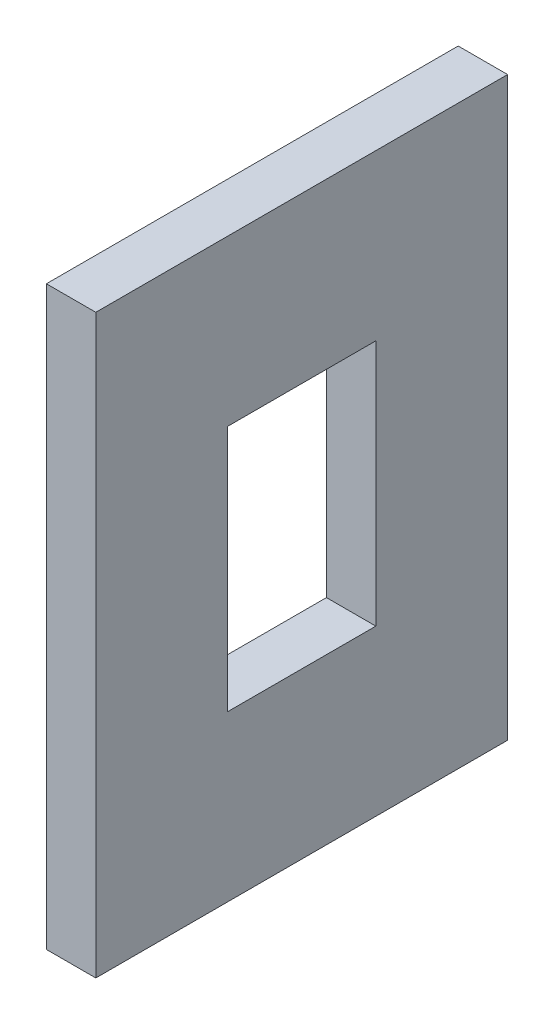
ISO-10303-21;
HEADER;
FILE_DESCRIPTION(('STEP AP214'),'2;1');
FILE_NAME('part.step','',(''),(''),'','','');
FILE_SCHEMA(('AUTOMOTIVE_DESIGN { 1 0 10303 214 1 1 1 1 }'));
ENDSEC;
DATA;
#1=APPLICATION_CONTEXT('core data for automotive mechanical design processes');
#2=APPLICATION_PROTOCOL_DEFINITION('international standard','automotive_design',2000,#1);
#3=PRODUCT_CONTEXT('',#1,'mechanical');
#4=PRODUCT('Part','Part','',(#3));
#5=PRODUCT_RELATED_PRODUCT_CATEGORY('part','',(#4));
#6=PRODUCT_DEFINITION_FORMATION('','',#4);
#7=PRODUCT_DEFINITION_CONTEXT('part definition',#1,'design');
#8=PRODUCT_DEFINITION('design','',#6,#7);
#9=PRODUCT_DEFINITION_SHAPE('','',#8);
#10=(LENGTH_UNIT() NAMED_UNIT(*) SI_UNIT(.MILLI.,.METRE.));
#11=(NAMED_UNIT(*) PLANE_ANGLE_UNIT() SI_UNIT($,.RADIAN.));
#12=(NAMED_UNIT(*) SI_UNIT($,.STERADIAN.) SOLID_ANGLE_UNIT());
#13=UNCERTAINTY_MEASURE_WITH_UNIT(LENGTH_MEASURE(1.E-05),#10,'distance_accuracy_value','');
#14=(GEOMETRIC_REPRESENTATION_CONTEXT(3) GLOBAL_UNCERTAINTY_ASSIGNED_CONTEXT((#13)) GLOBAL_UNIT_ASSIGNED_CONTEXT((#10,
#11,#12)) REPRESENTATION_CONTEXT('',''));
#15=CARTESIAN_POINT('',(0.,0.,0.));
#16=DIRECTION('',(0.,0.,1.));
#17=DIRECTION('',(1.,0.,0.));
#18=AXIS2_PLACEMENT_3D('',#15,#16,#17);
#19=CARTESIAN_POINT('',(6.,35.,25.));
#20=DIRECTION('',(0.,0.,-1.));
#21=DIRECTION('',(0.,1.,0.));
#22=AXIS2_PLACEMENT_3D('',#19,#20,#21);
#23=PLANE('',#22);
#24=DIRECTION('',(0.,-1.,0.));
#25=VECTOR('',#24,1.);
#26=CARTESIAN_POINT('',(0.,35.,25.));
#27=LINE('',#26,#25);
#28=CARTESIAN_POINT('',(0.,35.,25.));
#29=VERTEX_POINT('',#28);
#30=CARTESIAN_POINT('',(0.,-35.,25.));
#31=VERTEX_POINT('',#30);
#32=EDGE_CURVE('E135',#29,#31,#27,.T.);
#33=ORIENTED_EDGE('',*,*,#32,.T.);
#34=DIRECTION('',(-1.,0.,0.));
#35=VECTOR('',#34,1.);
#36=CARTESIAN_POINT('',(6.,-35.,25.));
#37=LINE('',#36,#35);
#38=CARTESIAN_POINT('',(6.,-35.,25.));
#39=VERTEX_POINT('',#38);
#40=EDGE_CURVE('E11',#39,#31,#37,.T.);
#41=ORIENTED_EDGE('',*,*,#40,.F.);
#42=DIRECTION('',(0.,-1.,0.));
#43=VECTOR('',#42,1.);
#44=CARTESIAN_POINT('',(6.,35.,25.));
#45=LINE('',#44,#43);
#46=CARTESIAN_POINT('',(6.,35.,25.));
#47=VERTEX_POINT('',#46);
#48=EDGE_CURVE('E139',#47,#39,#45,.T.);
#49=ORIENTED_EDGE('',*,*,#48,.F.);
#50=DIRECTION('',(-1.,0.,0.));
#51=VECTOR('',#50,1.);
#52=CARTESIAN_POINT('',(6.,35.,25.));
#53=LINE('',#52,#51);
#54=EDGE_CURVE('E151',#47,#29,#53,.T.);
#55=ORIENTED_EDGE('',*,*,#54,.T.);
#56=EDGE_LOOP('',(#33,#41,#49,#55));
#57=FACE_BOUND('',#56,.T.);
#58=ADVANCED_FACE('F38',(#57),#23,.F.);
#59=CARTESIAN_POINT('',(6.,-35.,25.));
#60=DIRECTION('',(0.,1.,0.));
#61=DIRECTION('',(0.,0.,1.));
#62=AXIS2_PLACEMENT_3D('',#59,#60,#61);
#63=PLANE('',#62);
#64=DIRECTION('',(0.,0.,-1.));
#65=VECTOR('',#64,1.);
#66=CARTESIAN_POINT('',(0.,-35.,25.));
#67=LINE('',#66,#65);
#68=CARTESIAN_POINT('',(0.,-35.,-25.));
#69=VERTEX_POINT('',#68);
#70=EDGE_CURVE('E154',#31,#69,#67,.T.);
#71=ORIENTED_EDGE('',*,*,#70,.T.);
#72=DIRECTION('',(-1.,0.,0.));
#73=VECTOR('',#72,1.);
#74=CARTESIAN_POINT('',(6.,-35.,-25.));
#75=LINE('',#74,#73);
#76=CARTESIAN_POINT('',(6.,-35.,-25.));
#77=VERTEX_POINT('',#76);
#78=EDGE_CURVE('E45',#77,#69,#75,.T.);
#79=ORIENTED_EDGE('',*,*,#78,.F.);
#80=DIRECTION('',(0.,0.,-1.));
#81=VECTOR('',#80,1.);
#82=CARTESIAN_POINT('',(6.,-35.,25.));
#83=LINE('',#82,#81);
#84=EDGE_CURVE('E142',#39,#77,#83,.T.);
#85=ORIENTED_EDGE('',*,*,#84,.F.);
#86=ORIENTED_EDGE('',*,*,#40,.T.);
#87=EDGE_LOOP('',(#71,#79,#85,#86));
#88=FACE_BOUND('',#87,.T.);
#89=ADVANCED_FACE('F170',(#88),#63,.F.);
#90=CARTESIAN_POINT('',(6.,35.,-25.));
#91=DIRECTION('',(0.,0.,-1.));
#92=DIRECTION('',(0.,1.,0.));
#93=AXIS2_PLACEMENT_3D('',#90,#91,#92);
#94=PLANE('',#93);
#95=DIRECTION('',(0.,-1.,0.));
#96=VECTOR('',#95,1.);
#97=CARTESIAN_POINT('',(0.,35.,-25.));
#98=LINE('',#97,#96);
#99=CARTESIAN_POINT('',(0.,35.,-25.));
#100=VERTEX_POINT('',#99);
#101=EDGE_CURVE('E157',#100,#69,#98,.T.);
#102=ORIENTED_EDGE('',*,*,#101,.F.);
#103=DIRECTION('',(-1.,0.,0.));
#104=VECTOR('',#103,1.);
#105=CARTESIAN_POINT('',(6.,35.,-25.));
#106=LINE('',#105,#104);
#107=CARTESIAN_POINT('',(6.,35.,-25.));
#108=VERTEX_POINT('',#107);
#109=EDGE_CURVE('E163',#108,#100,#106,.T.);
#110=ORIENTED_EDGE('',*,*,#109,.F.);
#111=DIRECTION('',(0.,-1.,0.));
#112=VECTOR('',#111,1.);
#113=CARTESIAN_POINT('',(6.,35.,-25.));
#114=LINE('',#113,#112);
#115=EDGE_CURVE('E145',#108,#77,#114,.T.);
#116=ORIENTED_EDGE('',*,*,#115,.T.);
#117=ORIENTED_EDGE('',*,*,#78,.T.);
#118=EDGE_LOOP('',(#102,#110,#116,#117));
#119=FACE_BOUND('',#118,.T.);
#120=ADVANCED_FACE('F167',(#119),#94,.T.);
#121=CARTESIAN_POINT('',(6.,35.,25.));
#122=DIRECTION('',(0.,1.,0.));
#123=DIRECTION('',(0.,0.,1.));
#124=AXIS2_PLACEMENT_3D('',#121,#122,#123);
#125=PLANE('',#124);
#126=DIRECTION('',(0.,0.,-1.));
#127=VECTOR('',#126,1.);
#128=CARTESIAN_POINT('',(0.,35.,25.));
#129=LINE('',#128,#127);
#130=EDGE_CURVE('E143',#29,#100,#129,.T.);
#131=ORIENTED_EDGE('',*,*,#130,.F.);
#132=ORIENTED_EDGE('',*,*,#54,.F.);
#133=DIRECTION('',(0.,0.,-1.));
#134=VECTOR('',#133,1.);
#135=CARTESIAN_POINT('',(6.,35.,25.));
#136=LINE('',#135,#134);
#137=EDGE_CURVE('E148',#47,#108,#136,.T.);
#138=ORIENTED_EDGE('',*,*,#137,.T.);
#139=ORIENTED_EDGE('',*,*,#109,.T.);
#140=EDGE_LOOP('',(#131,#132,#138,#139));
#141=FACE_BOUND('',#140,.T.);
#142=ADVANCED_FACE('F175',(#141),#125,.T.);
#143=CARTESIAN_POINT('',(6.,0.,0.));
#144=DIRECTION('',(1.,0.,0.));
#145=DIRECTION('',(0.,0.,-1.));
#146=AXIS2_PLACEMENT_3D('',#143,#144,#145);
#147=PLANE('',#146);
#148=DIRECTION('',(0.,1.,0.));
#149=VECTOR('',#148,1.);
#150=CARTESIAN_POINT('',(6.,15.,-9.00000000000001));
#151=LINE('',#150,#149);
#152=CARTESIAN_POINT('',(6.,-15.,-9.00000000000001));
#153=VERTEX_POINT('',#152);
#154=CARTESIAN_POINT('',(6.,15.,-9.00000000000001));
#155=VERTEX_POINT('',#154);
#156=EDGE_CURVE('E52',#153,#155,#151,.T.);
#157=ORIENTED_EDGE('',*,*,#156,.F.);
#158=DIRECTION('',(0.,0.,-1.));
#159=VECTOR('',#158,1.);
#160=CARTESIAN_POINT('',(6.,-15.,9.00000000000001));
#161=LINE('',#160,#159);
#162=CARTESIAN_POINT('',(6.,-15.,9.00000000000001));
#163=VERTEX_POINT('',#162);
#164=EDGE_CURVE('E120',#163,#153,#161,.T.);
#165=ORIENTED_EDGE('',*,*,#164,.F.);
#166=DIRECTION('',(0.,-1.,0.));
#167=VECTOR('',#166,1.);
#168=CARTESIAN_POINT('',(6.,15.,9.00000000000001));
#169=LINE('',#168,#167);
#170=CARTESIAN_POINT('',(6.,15.,9.00000000000001));
#171=VERTEX_POINT('',#170);
#172=EDGE_CURVE('E123',#171,#163,#169,.T.);
#173=ORIENTED_EDGE('',*,*,#172,.F.);
#174=DIRECTION('',(0.,0.,1.));
#175=VECTOR('',#174,1.);
#176=CARTESIAN_POINT('',(6.,15.,9.00000000000001));
#177=LINE('',#176,#175);
#178=EDGE_CURVE('E129',#155,#171,#177,.T.);
#179=ORIENTED_EDGE('',*,*,#178,.F.);
#180=EDGE_LOOP('',(#157,#165,#173,#179));
#181=FACE_BOUND('',#180,.T.);
#182=ORIENTED_EDGE('',*,*,#48,.T.);
#183=ORIENTED_EDGE('',*,*,#84,.T.);
#184=ORIENTED_EDGE('',*,*,#115,.F.);
#185=ORIENTED_EDGE('',*,*,#137,.F.);
#186=EDGE_LOOP('',(#182,#183,#184,#185));
#187=FACE_BOUND('',#186,.T.);
#188=ADVANCED_FACE('F179',(#181,#187),#147,.T.);
#189=CARTESIAN_POINT('',(0.,0.,0.));
#190=DIRECTION('',(1.,0.,0.));
#191=DIRECTION('',(0.,0.,-1.));
#192=AXIS2_PLACEMENT_3D('',#189,#190,#191);
#193=PLANE('',#192);
#194=DIRECTION('',(0.,0.,-1.));
#195=VECTOR('',#194,1.);
#196=CARTESIAN_POINT('',(0.,-15.,9.00000000000001));
#197=LINE('',#196,#195);
#198=CARTESIAN_POINT('',(0.,-15.,9.00000000000001));
#199=VERTEX_POINT('',#198);
#200=CARTESIAN_POINT('',(0.,-15.,-9.00000000000001));
#201=VERTEX_POINT('',#200);
#202=EDGE_CURVE('E110',#199,#201,#197,.T.);
#203=ORIENTED_EDGE('',*,*,#202,.T.);
#204=DIRECTION('',(0.,1.,0.));
#205=VECTOR('',#204,1.);
#206=CARTESIAN_POINT('',(0.,15.,-9.00000000000001));
#207=LINE('',#206,#205);
#208=CARTESIAN_POINT('',(0.,15.,-9.00000000000001));
#209=VERTEX_POINT('',#208);
#210=EDGE_CURVE('E104',#201,#209,#207,.T.);
#211=ORIENTED_EDGE('',*,*,#210,.T.);
#212=DIRECTION('',(0.,0.,1.));
#213=VECTOR('',#212,1.);
#214=CARTESIAN_POINT('',(0.,15.,9.00000000000001));
#215=LINE('',#214,#213);
#216=CARTESIAN_POINT('',(0.,15.,9.00000000000001));
#217=VERTEX_POINT('',#216);
#218=EDGE_CURVE('E113',#209,#217,#215,.T.);
#219=ORIENTED_EDGE('',*,*,#218,.T.);
#220=DIRECTION('',(0.,-1.,0.));
#221=VECTOR('',#220,1.);
#222=CARTESIAN_POINT('',(0.,15.,9.00000000000001));
#223=LINE('',#222,#221);
#224=EDGE_CURVE('E60',#217,#199,#223,.T.);
#225=ORIENTED_EDGE('',*,*,#224,.T.);
#226=EDGE_LOOP('',(#203,#211,#219,#225));
#227=FACE_BOUND('',#226,.T.);
#228=ORIENTED_EDGE('',*,*,#32,.F.);
#229=ORIENTED_EDGE('',*,*,#130,.T.);
#230=ORIENTED_EDGE('',*,*,#101,.T.);
#231=ORIENTED_EDGE('',*,*,#70,.F.);
#232=EDGE_LOOP('',(#228,#229,#230,#231));
#233=FACE_BOUND('',#232,.T.);
#234=ADVANCED_FACE('F117',(#227,#233),#193,.F.);
#235=CARTESIAN_POINT('',(0.,15.,-9.00000000000001));
#236=DIRECTION('',(0.,0.,-1.));
#237=DIRECTION('',(-1.,0.,0.));
#238=AXIS2_PLACEMENT_3D('',#235,#236,#237);
#239=PLANE('',#238);
#240=ORIENTED_EDGE('',*,*,#156,.T.);
#241=DIRECTION('',(1.,0.,0.));
#242=VECTOR('',#241,1.);
#243=CARTESIAN_POINT('',(0.,15.,-9.00000000000001));
#244=LINE('',#243,#242);
#245=EDGE_CURVE('E100',#209,#155,#244,.T.);
#246=ORIENTED_EDGE('',*,*,#245,.F.);
#247=ORIENTED_EDGE('',*,*,#210,.F.);
#248=DIRECTION('',(1.,0.,0.));
#249=VECTOR('',#248,1.);
#250=CARTESIAN_POINT('',(0.,-15.,-9.00000000000001));
#251=LINE('',#250,#249);
#252=EDGE_CURVE('E133',#201,#153,#251,.T.);
#253=ORIENTED_EDGE('',*,*,#252,.T.);
#254=EDGE_LOOP('',(#240,#246,#247,#253));
#255=FACE_BOUND('',#254,.T.);
#256=ADVANCED_FACE('F102',(#255),#239,.F.);
#257=CARTESIAN_POINT('',(0.,-15.,9.00000000000001));
#258=DIRECTION('',(0.,-1.,0.));
#259=DIRECTION('',(0.,0.,-1.));
#260=AXIS2_PLACEMENT_3D('',#257,#258,#259);
#261=PLANE('',#260);
#262=ORIENTED_EDGE('',*,*,#164,.T.);
#263=ORIENTED_EDGE('',*,*,#252,.F.);
#264=ORIENTED_EDGE('',*,*,#202,.F.);
#265=DIRECTION('',(1.,0.,0.));
#266=VECTOR('',#265,1.);
#267=CARTESIAN_POINT('',(0.,-15.,9.00000000000001));
#268=LINE('',#267,#266);
#269=EDGE_CURVE('E136',#199,#163,#268,.T.);
#270=ORIENTED_EDGE('',*,*,#269,.T.);
#271=EDGE_LOOP('',(#262,#263,#264,#270));
#272=FACE_BOUND('',#271,.T.);
#273=ADVANCED_FACE('F199',(#272),#261,.F.);
#274=CARTESIAN_POINT('',(0.,15.,9.00000000000001));
#275=DIRECTION('',(0.,0.,1.));
#276=DIRECTION('',(1.,0.,0.));
#277=AXIS2_PLACEMENT_3D('',#274,#275,#276);
#278=PLANE('',#277);
#279=ORIENTED_EDGE('',*,*,#172,.T.);
#280=ORIENTED_EDGE('',*,*,#269,.F.);
#281=ORIENTED_EDGE('',*,*,#224,.F.);
#282=DIRECTION('',(1.,0.,0.));
#283=VECTOR('',#282,1.);
#284=CARTESIAN_POINT('',(0.,15.,9.00000000000001));
#285=LINE('',#284,#283);
#286=EDGE_CURVE('E109',#217,#171,#285,.T.);
#287=ORIENTED_EDGE('',*,*,#286,.T.);
#288=EDGE_LOOP('',(#279,#280,#281,#287));
#289=FACE_BOUND('',#288,.T.);
#290=ADVANCED_FACE('F202',(#289),#278,.F.);
#291=CARTESIAN_POINT('',(0.,15.,9.00000000000001));
#292=DIRECTION('',(0.,1.,0.));
#293=DIRECTION('',(0.,0.,1.));
#294=AXIS2_PLACEMENT_3D('',#291,#292,#293);
#295=PLANE('',#294);
#296=ORIENTED_EDGE('',*,*,#178,.T.);
#297=ORIENTED_EDGE('',*,*,#286,.F.);
#298=ORIENTED_EDGE('',*,*,#218,.F.);
#299=ORIENTED_EDGE('',*,*,#245,.T.);
#300=EDGE_LOOP('',(#296,#297,#298,#299));
#301=FACE_BOUND('',#300,.T.);
#302=ADVANCED_FACE('F114',(#301),#295,.F.);
#303=CLOSED_SHELL('',(#58,#89,#120,#142,#188,#234,#256,#273,#290,#302));
#304=MANIFOLD_SOLID_BREP('B2',#303);
#305=ADVANCED_BREP_SHAPE_REPRESENTATION('',(#18,#304),#14);
#306=SHAPE_DEFINITION_REPRESENTATION(#9,#305);
ENDSEC;
END-ISO-10303-21;
